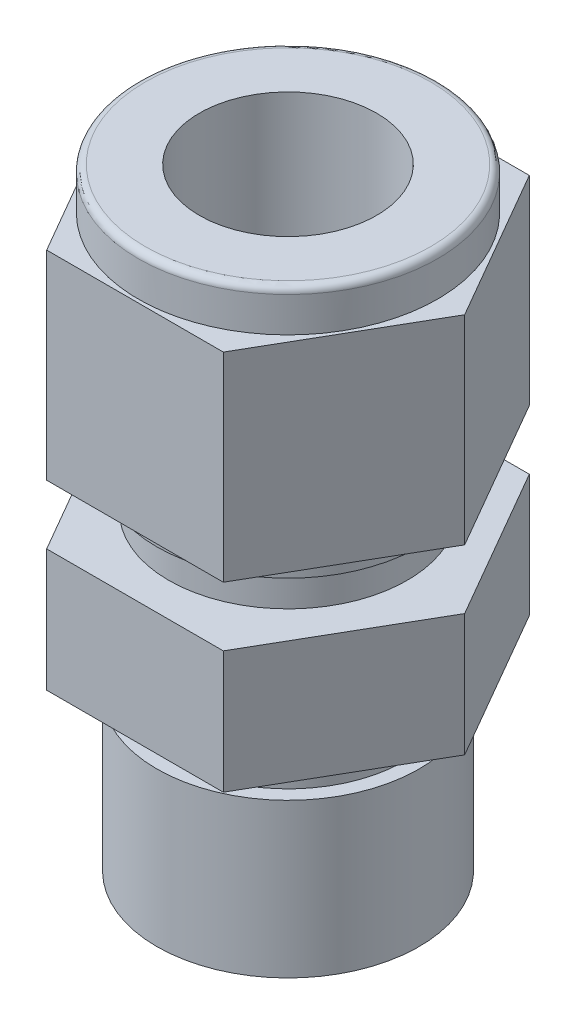
ISO-10303-21;
HEADER;
FILE_DESCRIPTION(('STEP AP214'),'2;1');
FILE_NAME('part.step','',(''),(''),'','','');
FILE_SCHEMA(('AUTOMOTIVE_DESIGN { 1 0 10303 214 1 1 1 1 }'));
ENDSEC;
DATA;
#1=APPLICATION_CONTEXT('core data for automotive mechanical design processes');
#2=APPLICATION_PROTOCOL_DEFINITION('international standard','automotive_design',2000,#1);
#3=PRODUCT_CONTEXT('',#1,'mechanical');
#4=PRODUCT('Part','Part','',(#3));
#5=PRODUCT_RELATED_PRODUCT_CATEGORY('part','',(#4));
#6=PRODUCT_DEFINITION_FORMATION('','',#4);
#7=PRODUCT_DEFINITION_CONTEXT('part definition',#1,'design');
#8=PRODUCT_DEFINITION('design','',#6,#7);
#9=PRODUCT_DEFINITION_SHAPE('','',#8);
#10=(LENGTH_UNIT() NAMED_UNIT(*) SI_UNIT(.MILLI.,.METRE.));
#11=(NAMED_UNIT(*) PLANE_ANGLE_UNIT() SI_UNIT($,.RADIAN.));
#12=(NAMED_UNIT(*) SI_UNIT($,.STERADIAN.) SOLID_ANGLE_UNIT());
#13=UNCERTAINTY_MEASURE_WITH_UNIT(LENGTH_MEASURE(1.E-05),#10,'distance_accuracy_value','');
#14=(GEOMETRIC_REPRESENTATION_CONTEXT(3) GLOBAL_UNCERTAINTY_ASSIGNED_CONTEXT((#13)) GLOBAL_UNIT_ASSIGNED_CONTEXT((#10,
#11,#12)) REPRESENTATION_CONTEXT('',''));
#15=CARTESIAN_POINT('',(0.,0.,0.));
#16=DIRECTION('',(0.,0.,1.));
#17=DIRECTION('',(1.,0.,0.));
#18=AXIS2_PLACEMENT_3D('',#15,#16,#17);
#19=CARTESIAN_POINT('',(0.,11.176,0.));
#20=DIRECTION('',(0.,-1.,0.));
#21=DIRECTION('',(0.,0.,-1.));
#22=AXIS2_PLACEMENT_3D('',#19,#20,#21);
#23=CYLINDRICAL_SURFACE('',#22,9.525);
#24=CARTESIAN_POINT('',(0.,11.176,0.));
#25=DIRECTION('',(0.,1.,0.));
#26=DIRECTION('',(0.,0.,1.));
#27=AXIS2_PLACEMENT_3D('',#24,#25,#26);
#28=CIRCLE('',#27,9.525);
#29=CARTESIAN_POINT('',(0.,11.176,9.525));
#30=VERTEX_POINT('',#29);
#31=EDGE_CURVE('E152',#30,#30,#28,.T.);
#32=ORIENTED_EDGE('',*,*,#31,.F.);
#33=EDGE_LOOP('',(#32));
#34=FACE_BOUND('',#33,.T.);
#35=CARTESIAN_POINT('',(0.,0.,0.));
#36=DIRECTION('',(0.,1.,0.));
#37=DIRECTION('',(0.,0.,1.));
#38=AXIS2_PLACEMENT_3D('',#35,#36,#37);
#39=CIRCLE('',#38,9.525);
#40=CARTESIAN_POINT('',(0.,0.,9.525));
#41=VERTEX_POINT('',#40);
#42=EDGE_CURVE('E149',#41,#41,#39,.T.);
#43=ORIENTED_EDGE('',*,*,#42,.T.);
#44=EDGE_LOOP('',(#43));
#45=FACE_BOUND('',#44,.T.);
#46=ADVANCED_FACE('F35',(#34,#45),#23,.T.);
#47=CARTESIAN_POINT('',(0.,11.176,0.));
#48=DIRECTION('',(0.,1.,0.));
#49=DIRECTION('',(0.,0.,1.));
#50=AXIS2_PLACEMENT_3D('',#47,#48,#49);
#51=PLANE('',#50);
#52=CARTESIAN_POINT('',(0.,11.176,0.));
#53=DIRECTION('',(0.,1.,0.));
#54=DIRECTION('',(0.,0.,1.));
#55=AXIS2_PLACEMENT_3D('',#52,#53,#54);
#56=CIRCLE('',#55,8.509);
#57=CARTESIAN_POINT('',(0.,11.176,8.509));
#58=VERTEX_POINT('',#57);
#59=EDGE_CURVE('E145',#58,#58,#56,.T.);
#60=ORIENTED_EDGE('',*,*,#59,.F.);
#61=EDGE_LOOP('',(#60));
#62=FACE_BOUND('',#61,.T.);
#63=ORIENTED_EDGE('',*,*,#31,.T.);
#64=EDGE_LOOP('',(#63));
#65=FACE_BOUND('',#64,.T.);
#66=ADVANCED_FACE('F175',(#62,#65),#51,.T.);
#67=CARTESIAN_POINT('',(0.,0.,0.));
#68=DIRECTION('',(0.,1.,0.));
#69=DIRECTION('',(0.,0.,1.));
#70=AXIS2_PLACEMENT_3D('',#67,#68,#69);
#71=PLANE('',#70);
#72=CARTESIAN_POINT('',(0.,0.,0.));
#73=DIRECTION('',(0.,1.,0.));
#74=DIRECTION('',(0.,0.,1.));
#75=AXIS2_PLACEMENT_3D('',#72,#73,#74);
#76=CIRCLE('',#75,6.4389);
#77=CARTESIAN_POINT('',(0.,0.,6.4389));
#78=VERTEX_POINT('',#77);
#79=EDGE_CURVE('E271',#78,#78,#76,.T.);
#80=ORIENTED_EDGE('',*,*,#79,.T.);
#81=EDGE_LOOP('',(#80));
#82=FACE_BOUND('',#81,.T.);
#83=ORIENTED_EDGE('',*,*,#42,.F.);
#84=EDGE_LOOP('',(#83));
#85=FACE_BOUND('',#84,.T.);
#86=ADVANCED_FACE('F180',(#82,#85),#71,.F.);
#87=CARTESIAN_POINT('',(0.,13.716,0.));
#88=DIRECTION('',(0.,-1.,0.));
#89=DIRECTION('',(0.,0.,-1.));
#90=AXIS2_PLACEMENT_3D('',#87,#88,#89);
#91=CYLINDRICAL_SURFACE('',#90,8.509);
#92=CARTESIAN_POINT('',(0.,13.716,0.));
#93=DIRECTION('',(0.,1.,0.));
#94=DIRECTION('',(0.,0.,1.));
#95=AXIS2_PLACEMENT_3D('',#92,#93,#94);
#96=CIRCLE('',#95,8.509);
#97=CARTESIAN_POINT('',(0.,13.716,8.509));
#98=VERTEX_POINT('',#97);
#99=EDGE_CURVE('E146',#98,#98,#96,.T.);
#100=ORIENTED_EDGE('',*,*,#99,.F.);
#101=EDGE_LOOP('',(#100));
#102=FACE_BOUND('',#101,.T.);
#103=ORIENTED_EDGE('',*,*,#59,.T.);
#104=EDGE_LOOP('',(#103));
#105=FACE_BOUND('',#104,.T.);
#106=ADVANCED_FACE('F187',(#102,#105),#91,.T.);
#107=CARTESIAN_POINT('',(6.41580486636972,22.606,11.1125));
#108=DIRECTION('',(-0.866025403784439,0.,-0.5));
#109=DIRECTION('',(-0.5,0.,0.866025403784439));
#110=AXIS2_PLACEMENT_3D('',#107,#108,#109);
#111=PLANE('',#110);
#112=DIRECTION('',(0.5,0.,-0.866025403784439));
#113=VECTOR('',#112,1.);
#114=CARTESIAN_POINT('',(6.41580486636972,13.716,11.1125));
#115=LINE('',#114,#113);
#116=CARTESIAN_POINT('',(6.41580486636972,13.716,11.1125));
#117=VERTEX_POINT('',#116);
#118=CARTESIAN_POINT('',(12.8316097327394,13.716,0.));
#119=VERTEX_POINT('',#118);
#120=EDGE_CURVE('E125',#117,#119,#115,.T.);
#121=ORIENTED_EDGE('',*,*,#120,.T.);
#122=DIRECTION('',(0.,-1.,0.));
#123=VECTOR('',#122,1.);
#124=CARTESIAN_POINT('',(12.8316097327394,22.606,0.));
#125=LINE('',#124,#123);
#126=CARTESIAN_POINT('',(12.8316097327394,22.606,0.));
#127=VERTEX_POINT('',#126);
#128=EDGE_CURVE('E143',#127,#119,#125,.T.);
#129=ORIENTED_EDGE('',*,*,#128,.F.);
#130=DIRECTION('',(0.5,0.,-0.866025403784439));
#131=VECTOR('',#130,1.);
#132=CARTESIAN_POINT('',(6.41580486636972,22.606,11.1125));
#133=LINE('',#132,#131);
#134=CARTESIAN_POINT('',(6.41580486636972,22.606,11.1125));
#135=VERTEX_POINT('',#134);
#136=EDGE_CURVE('E136',#135,#127,#133,.T.);
#137=ORIENTED_EDGE('',*,*,#136,.F.);
#138=DIRECTION('',(0.,-1.,0.));
#139=VECTOR('',#138,1.);
#140=CARTESIAN_POINT('',(6.41580486636972,22.606,11.1125));
#141=LINE('',#140,#139);
#142=EDGE_CURVE('E121',#135,#117,#141,.T.);
#143=ORIENTED_EDGE('',*,*,#142,.T.);
#144=EDGE_LOOP('',(#121,#129,#137,#143));
#145=FACE_BOUND('',#144,.T.);
#146=ADVANCED_FACE('F192',(#145),#111,.F.);
#147=CARTESIAN_POINT('',(12.8316097327394,22.606,0.));
#148=DIRECTION('',(-0.866025403784438,0.,0.5));
#149=DIRECTION('',(0.5,0.,0.866025403784438));
#150=AXIS2_PLACEMENT_3D('',#147,#148,#149);
#151=PLANE('',#150);
#152=DIRECTION('',(-0.5,0.,-0.866025403784438));
#153=VECTOR('',#152,1.);
#154=CARTESIAN_POINT('',(12.8316097327394,13.716,0.));
#155=LINE('',#154,#153);
#156=CARTESIAN_POINT('',(6.41580486636971,13.716,-11.1125));
#157=VERTEX_POINT('',#156);
#158=EDGE_CURVE('E128',#119,#157,#155,.T.);
#159=ORIENTED_EDGE('',*,*,#158,.T.);
#160=DIRECTION('',(0.,-1.,0.));
#161=VECTOR('',#160,1.);
#162=CARTESIAN_POINT('',(6.41580486636971,22.606,-11.1125));
#163=LINE('',#162,#161);
#164=CARTESIAN_POINT('',(6.41580486636971,22.606,-11.1125));
#165=VERTEX_POINT('',#164);
#166=EDGE_CURVE('E140',#165,#157,#163,.T.);
#167=ORIENTED_EDGE('',*,*,#166,.F.);
#168=DIRECTION('',(-0.5,0.,-0.866025403784438));
#169=VECTOR('',#168,1.);
#170=CARTESIAN_POINT('',(12.8316097327394,22.606,0.));
#171=LINE('',#170,#169);
#172=EDGE_CURVE('E91',#127,#165,#171,.T.);
#173=ORIENTED_EDGE('',*,*,#172,.F.);
#174=ORIENTED_EDGE('',*,*,#128,.T.);
#175=EDGE_LOOP('',(#159,#167,#173,#174));
#176=FACE_BOUND('',#175,.T.);
#177=ADVANCED_FACE('F196',(#176),#151,.F.);
#178=CARTESIAN_POINT('',(6.41580486636971,22.606,-11.1125));
#179=DIRECTION('',(0.,0.,1.));
#180=DIRECTION('',(1.,0.,0.));
#181=AXIS2_PLACEMENT_3D('',#178,#179,#180);
#182=PLANE('',#181);
#183=DIRECTION('',(-1.,0.,0.));
#184=VECTOR('',#183,1.);
#185=CARTESIAN_POINT('',(6.41580486636971,13.716,-11.1125));
#186=LINE('',#185,#184);
#187=CARTESIAN_POINT('',(-6.41580486636972,13.716,-11.1125));
#188=VERTEX_POINT('',#187);
#189=EDGE_CURVE('E131',#157,#188,#186,.T.);
#190=ORIENTED_EDGE('',*,*,#189,.T.);
#191=DIRECTION('',(0.,-1.,0.));
#192=VECTOR('',#191,1.);
#193=CARTESIAN_POINT('',(-6.41580486636972,22.606,-11.1125));
#194=LINE('',#193,#192);
#195=CARTESIAN_POINT('',(-6.41580486636972,22.606,-11.1125));
#196=VERTEX_POINT('',#195);
#197=EDGE_CURVE('E116',#196,#188,#194,.T.);
#198=ORIENTED_EDGE('',*,*,#197,.F.);
#199=DIRECTION('',(-1.,0.,0.));
#200=VECTOR('',#199,1.);
#201=CARTESIAN_POINT('',(6.41580486636971,22.606,-11.1125));
#202=LINE('',#201,#200);
#203=EDGE_CURVE('E107',#165,#196,#202,.T.);
#204=ORIENTED_EDGE('',*,*,#203,.F.);
#205=ORIENTED_EDGE('',*,*,#166,.T.);
#206=EDGE_LOOP('',(#190,#198,#204,#205));
#207=FACE_BOUND('',#206,.T.);
#208=ADVANCED_FACE('F200',(#207),#182,.F.);
#209=CARTESIAN_POINT('',(-6.41580486636972,22.606,-11.1125));
#210=DIRECTION('',(0.866025403784439,0.,0.5));
#211=DIRECTION('',(0.5,0.,-0.866025403784439));
#212=AXIS2_PLACEMENT_3D('',#209,#210,#211);
#213=PLANE('',#212);
#214=DIRECTION('',(-0.5,0.,0.866025403784438));
#215=VECTOR('',#214,1.);
#216=CARTESIAN_POINT('',(-6.41580486636972,13.716,-11.1125));
#217=LINE('',#216,#215);
#218=CARTESIAN_POINT('',(-12.8316097327394,13.716,0.));
#219=VERTEX_POINT('',#218);
#220=EDGE_CURVE('E115',#188,#219,#217,.T.);
#221=ORIENTED_EDGE('',*,*,#220,.T.);
#222=DIRECTION('',(0.,-1.,0.));
#223=VECTOR('',#222,1.);
#224=CARTESIAN_POINT('',(-12.8316097327394,22.606,0.));
#225=LINE('',#224,#223);
#226=CARTESIAN_POINT('',(-12.8316097327394,22.606,0.));
#227=VERTEX_POINT('',#226);
#228=EDGE_CURVE('E112',#227,#219,#225,.T.);
#229=ORIENTED_EDGE('',*,*,#228,.F.);
#230=DIRECTION('',(-0.5,0.,0.866025403784438));
#231=VECTOR('',#230,1.);
#232=CARTESIAN_POINT('',(-6.41580486636972,22.606,-11.1125));
#233=LINE('',#232,#231);
#234=EDGE_CURVE('E101',#196,#227,#233,.T.);
#235=ORIENTED_EDGE('',*,*,#234,.F.);
#236=ORIENTED_EDGE('',*,*,#197,.T.);
#237=EDGE_LOOP('',(#221,#229,#235,#236));
#238=FACE_BOUND('',#237,.T.);
#239=ADVANCED_FACE('F113',(#238),#213,.F.);
#240=CARTESIAN_POINT('',(-12.8316097327394,22.606,0.));
#241=DIRECTION('',(0.866025403784438,0.,-0.5));
#242=DIRECTION('',(-0.5,0.,-0.866025403784439));
#243=AXIS2_PLACEMENT_3D('',#240,#241,#242);
#244=PLANE('',#243);
#245=DIRECTION('',(0.5,0.,0.866025403784439));
#246=VECTOR('',#245,1.);
#247=CARTESIAN_POINT('',(-12.8316097327394,13.716,0.));
#248=LINE('',#247,#246);
#249=CARTESIAN_POINT('',(-6.41580486636971,13.716,11.1125));
#250=VERTEX_POINT('',#249);
#251=EDGE_CURVE('E76',#219,#250,#248,.T.);
#252=ORIENTED_EDGE('',*,*,#251,.T.);
#253=DIRECTION('',(0.,-1.,0.));
#254=VECTOR('',#253,1.);
#255=CARTESIAN_POINT('',(-6.41580486636971,22.606,11.1125));
#256=LINE('',#255,#254);
#257=CARTESIAN_POINT('',(-6.41580486636971,22.606,11.1125));
#258=VERTEX_POINT('',#257);
#259=EDGE_CURVE('E117',#258,#250,#256,.T.);
#260=ORIENTED_EDGE('',*,*,#259,.F.);
#261=DIRECTION('',(0.5,0.,0.866025403784439));
#262=VECTOR('',#261,1.);
#263=CARTESIAN_POINT('',(-12.8316097327394,22.606,0.));
#264=LINE('',#263,#262);
#265=EDGE_CURVE('E105',#227,#258,#264,.T.);
#266=ORIENTED_EDGE('',*,*,#265,.F.);
#267=ORIENTED_EDGE('',*,*,#228,.T.);
#268=EDGE_LOOP('',(#252,#260,#266,#267));
#269=FACE_BOUND('',#268,.T.);
#270=ADVANCED_FACE('F119',(#269),#244,.F.);
#271=CARTESIAN_POINT('',(-6.41580486636971,22.606,11.1125));
#272=DIRECTION('',(0.,0.,-1.));
#273=DIRECTION('',(-1.,0.,0.));
#274=AXIS2_PLACEMENT_3D('',#271,#272,#273);
#275=PLANE('',#274);
#276=DIRECTION('',(1.,0.,0.));
#277=VECTOR('',#276,1.);
#278=CARTESIAN_POINT('',(-6.41580486636971,13.716,11.1125));
#279=LINE('',#278,#277);
#280=EDGE_CURVE('E82',#250,#117,#279,.T.);
#281=ORIENTED_EDGE('',*,*,#280,.T.);
#282=ORIENTED_EDGE('',*,*,#142,.F.);
#283=DIRECTION('',(1.,0.,0.));
#284=VECTOR('',#283,1.);
#285=CARTESIAN_POINT('',(-6.41580486636971,22.606,11.1125));
#286=LINE('',#285,#284);
#287=EDGE_CURVE('E52',#258,#135,#286,.T.);
#288=ORIENTED_EDGE('',*,*,#287,.F.);
#289=ORIENTED_EDGE('',*,*,#259,.T.);
#290=EDGE_LOOP('',(#281,#282,#288,#289));
#291=FACE_BOUND('',#290,.T.);
#292=ADVANCED_FACE('F208',(#291),#275,.F.);
#293=CARTESIAN_POINT('',(0.,22.606,0.));
#294=DIRECTION('',(0.,1.,0.));
#295=DIRECTION('',(0.,0.,1.));
#296=AXIS2_PLACEMENT_3D('',#293,#294,#295);
#297=PLANE('',#296);
#298=CARTESIAN_POINT('',(0.,22.606,0.));
#299=DIRECTION('',(0.,1.,0.));
#300=DIRECTION('',(0.,0.,1.));
#301=AXIS2_PLACEMENT_3D('',#298,#299,#300);
#302=CIRCLE('',#301,8.6614);
#303=CARTESIAN_POINT('',(0.,22.606,8.6614));
#304=VERTEX_POINT('',#303);
#305=EDGE_CURVE('E335',#304,#304,#302,.T.);
#306=ORIENTED_EDGE('',*,*,#305,.F.);
#307=EDGE_LOOP('',(#306));
#308=FACE_BOUND('',#307,.T.);
#309=ORIENTED_EDGE('',*,*,#136,.T.);
#310=ORIENTED_EDGE('',*,*,#172,.T.);
#311=ORIENTED_EDGE('',*,*,#203,.T.);
#312=ORIENTED_EDGE('',*,*,#234,.T.);
#313=ORIENTED_EDGE('',*,*,#265,.T.);
#314=ORIENTED_EDGE('',*,*,#287,.T.);
#315=EDGE_LOOP('',(#309,#310,#311,#312,#313,#314));
#316=FACE_BOUND('',#315,.T.);
#317=ADVANCED_FACE('F103',(#308,#316),#297,.T.);
#318=CARTESIAN_POINT('',(0.,13.716,0.));
#319=DIRECTION('',(0.,1.,0.));
#320=DIRECTION('',(0.,0.,1.));
#321=AXIS2_PLACEMENT_3D('',#318,#319,#320);
#322=PLANE('',#321);
#323=ORIENTED_EDGE('',*,*,#99,.T.);
#324=EDGE_LOOP('',(#323));
#325=FACE_BOUND('',#324,.T.);
#326=ORIENTED_EDGE('',*,*,#120,.F.);
#327=ORIENTED_EDGE('',*,*,#280,.F.);
#328=ORIENTED_EDGE('',*,*,#251,.F.);
#329=ORIENTED_EDGE('',*,*,#220,.F.);
#330=ORIENTED_EDGE('',*,*,#189,.F.);
#331=ORIENTED_EDGE('',*,*,#158,.F.);
#332=EDGE_LOOP('',(#326,#327,#328,#329,#330,#331));
#333=FACE_BOUND('',#332,.T.);
#334=ADVANCED_FACE('F211',(#325,#333),#322,.F.);
#335=CARTESIAN_POINT('',(0.,25.146,0.));
#336=DIRECTION('',(0.,-1.,0.));
#337=DIRECTION('',(0.,0.,-1.));
#338=AXIS2_PLACEMENT_3D('',#335,#336,#337);
#339=CYLINDRICAL_SURFACE('',#338,8.6614);
#340=CARTESIAN_POINT('',(0.,25.146,0.));
#341=DIRECTION('',(0.,1.,0.));
#342=DIRECTION('',(0.,0.,1.));
#343=AXIS2_PLACEMENT_3D('',#340,#341,#342);
#344=CIRCLE('',#343,8.6614);
#345=CARTESIAN_POINT('',(0.,25.146,8.6614));
#346=VERTEX_POINT('',#345);
#347=EDGE_CURVE('E129',#346,#346,#344,.T.);
#348=ORIENTED_EDGE('',*,*,#347,.F.);
#349=EDGE_LOOP('',(#348));
#350=FACE_BOUND('',#349,.T.);
#351=ORIENTED_EDGE('',*,*,#305,.T.);
#352=EDGE_LOOP('',(#351));
#353=FACE_BOUND('',#352,.T.);
#354=ADVANCED_FACE('F214',(#350,#353),#339,.T.);
#355=CARTESIAN_POINT('',(0.,26.924,0.));
#356=DIRECTION('',(0.,-1.,0.));
#357=DIRECTION('',(0.,0.,-1.));
#358=AXIS2_PLACEMENT_3D('',#355,#356,#357);
#359=CYLINDRICAL_SURFACE('',#358,9.525);
#360=CARTESIAN_POINT('',(0.,26.924,0.));
#361=DIRECTION('',(0.,1.,0.));
#362=DIRECTION('',(0.,0.,1.));
#363=AXIS2_PLACEMENT_3D('',#360,#361,#362);
#364=CIRCLE('',#363,9.525);
#365=CARTESIAN_POINT('',(0.,26.924,9.525));
#366=VERTEX_POINT('',#365);
#367=EDGE_CURVE('E332',#366,#366,#364,.T.);
#368=ORIENTED_EDGE('',*,*,#367,.F.);
#369=EDGE_LOOP('',(#368));
#370=FACE_BOUND('',#369,.T.);
#371=CARTESIAN_POINT('',(0.,25.146,0.));
#372=DIRECTION('',(0.,1.,0.));
#373=DIRECTION('',(0.,0.,1.));
#374=AXIS2_PLACEMENT_3D('',#371,#372,#373);
#375=CIRCLE('',#374,9.525);
#376=CARTESIAN_POINT('',(0.,25.146,9.525));
#377=VERTEX_POINT('',#376);
#378=EDGE_CURVE('E331',#377,#377,#375,.T.);
#379=ORIENTED_EDGE('',*,*,#378,.T.);
#380=EDGE_LOOP('',(#379));
#381=FACE_BOUND('',#380,.T.);
#382=ADVANCED_FACE('F221',(#370,#381),#359,.T.);
#383=CARTESIAN_POINT('',(0.,25.146,0.));
#384=DIRECTION('',(0.,1.,0.));
#385=DIRECTION('',(0.,0.,1.));
#386=AXIS2_PLACEMENT_3D('',#383,#384,#385);
#387=PLANE('',#386);
#388=ORIENTED_EDGE('',*,*,#347,.T.);
#389=EDGE_LOOP('',(#388));
#390=FACE_BOUND('',#389,.T.);
#391=ORIENTED_EDGE('',*,*,#378,.F.);
#392=EDGE_LOOP('',(#391));
#393=FACE_BOUND('',#392,.T.);
#394=ADVANCED_FACE('F225',(#390,#393),#387,.F.);
#395=CARTESIAN_POINT('',(-12.8316097327394,41.402,0.));
#396=DIRECTION('',(0.866025403784439,0.,-0.5));
#397=DIRECTION('',(-0.5,0.,-0.866025403784439));
#398=AXIS2_PLACEMENT_3D('',#395,#396,#397);
#399=PLANE('',#398);
#400=DIRECTION('',(0.5,0.,0.866025403784439));
#401=VECTOR('',#400,1.);
#402=CARTESIAN_POINT('',(-12.8316097327394,26.924,0.));
#403=LINE('',#402,#401);
#404=CARTESIAN_POINT('',(-12.8316097327394,26.924,0.));
#405=VERTEX_POINT('',#404);
#406=CARTESIAN_POINT('',(-6.41580486636972,26.924,11.1125));
#407=VERTEX_POINT('',#406);
#408=EDGE_CURVE('E270',#405,#407,#403,.T.);
#409=ORIENTED_EDGE('',*,*,#408,.T.);
#410=DIRECTION('',(0.,-1.,0.));
#411=VECTOR('',#410,1.);
#412=CARTESIAN_POINT('',(-6.41580486636972,41.402,11.1125));
#413=LINE('',#412,#411);
#414=CARTESIAN_POINT('',(-6.41580486636972,41.402,11.1125));
#415=VERTEX_POINT('',#414);
#416=EDGE_CURVE('E328',#415,#407,#413,.T.);
#417=ORIENTED_EDGE('',*,*,#416,.F.);
#418=DIRECTION('',(0.5,0.,0.866025403784439));
#419=VECTOR('',#418,1.);
#420=CARTESIAN_POINT('',(-12.8316097327394,41.402,0.));
#421=LINE('',#420,#419);
#422=CARTESIAN_POINT('',(-12.8316097327394,41.402,0.));
#423=VERTEX_POINT('',#422);
#424=EDGE_CURVE('E281',#423,#415,#421,.T.);
#425=ORIENTED_EDGE('',*,*,#424,.F.);
#426=DIRECTION('',(0.,-1.,0.));
#427=VECTOR('',#426,1.);
#428=CARTESIAN_POINT('',(-12.8316097327394,41.402,0.));
#429=LINE('',#428,#427);
#430=EDGE_CURVE('E299',#423,#405,#429,.T.);
#431=ORIENTED_EDGE('',*,*,#430,.T.);
#432=EDGE_LOOP('',(#409,#417,#425,#431));
#433=FACE_BOUND('',#432,.T.);
#434=ADVANCED_FACE('F229',(#433),#399,.F.);
#435=CARTESIAN_POINT('',(-6.41580486636972,41.402,11.1125));
#436=DIRECTION('',(0.,0.,-1.));
#437=DIRECTION('',(-1.,0.,0.));
#438=AXIS2_PLACEMENT_3D('',#435,#436,#437);
#439=PLANE('',#438);
#440=DIRECTION('',(1.,0.,0.));
#441=VECTOR('',#440,1.);
#442=CARTESIAN_POINT('',(-6.41580486636972,26.924,11.1125));
#443=LINE('',#442,#441);
#444=CARTESIAN_POINT('',(6.41580486636972,26.924,11.1125));
#445=VERTEX_POINT('',#444);
#446=EDGE_CURVE('E274',#407,#445,#443,.T.);
#447=ORIENTED_EDGE('',*,*,#446,.T.);
#448=DIRECTION('',(0.,-1.,0.));
#449=VECTOR('',#448,1.);
#450=CARTESIAN_POINT('',(6.41580486636972,41.402,11.1125));
#451=LINE('',#450,#449);
#452=CARTESIAN_POINT('',(6.41580486636972,41.402,11.1125));
#453=VERTEX_POINT('',#452);
#454=EDGE_CURVE('E325',#453,#445,#451,.T.);
#455=ORIENTED_EDGE('',*,*,#454,.F.);
#456=DIRECTION('',(1.,0.,0.));
#457=VECTOR('',#456,1.);
#458=CARTESIAN_POINT('',(-6.41580486636972,41.402,11.1125));
#459=LINE('',#458,#457);
#460=EDGE_CURVE('E284',#415,#453,#459,.T.);
#461=ORIENTED_EDGE('',*,*,#460,.F.);
#462=ORIENTED_EDGE('',*,*,#416,.T.);
#463=EDGE_LOOP('',(#447,#455,#461,#462));
#464=FACE_BOUND('',#463,.T.);
#465=ADVANCED_FACE('F233',(#464),#439,.F.);
#466=CARTESIAN_POINT('',(6.41580486636972,41.402,11.1125));
#467=DIRECTION('',(-0.866025403784439,0.,-0.5));
#468=DIRECTION('',(-0.5,0.,0.866025403784439));
#469=AXIS2_PLACEMENT_3D('',#466,#467,#468);
#470=PLANE('',#469);
#471=DIRECTION('',(0.5,0.,-0.866025403784439));
#472=VECTOR('',#471,1.);
#473=CARTESIAN_POINT('',(6.41580486636972,26.924,11.1125));
#474=LINE('',#473,#472);
#475=CARTESIAN_POINT('',(12.8316097327394,26.924,0.));
#476=VERTEX_POINT('',#475);
#477=EDGE_CURVE('E303',#445,#476,#474,.T.);
#478=ORIENTED_EDGE('',*,*,#477,.T.);
#479=DIRECTION('',(0.,-1.,0.));
#480=VECTOR('',#479,1.);
#481=CARTESIAN_POINT('',(12.8316097327394,41.402,0.));
#482=LINE('',#481,#480);
#483=CARTESIAN_POINT('',(12.8316097327394,41.402,0.));
#484=VERTEX_POINT('',#483);
#485=EDGE_CURVE('E322',#484,#476,#482,.T.);
#486=ORIENTED_EDGE('',*,*,#485,.F.);
#487=DIRECTION('',(0.5,0.,-0.866025403784439));
#488=VECTOR('',#487,1.);
#489=CARTESIAN_POINT('',(6.41580486636972,41.402,11.1125));
#490=LINE('',#489,#488);
#491=EDGE_CURVE('E288',#453,#484,#490,.T.);
#492=ORIENTED_EDGE('',*,*,#491,.F.);
#493=ORIENTED_EDGE('',*,*,#454,.T.);
#494=EDGE_LOOP('',(#478,#486,#492,#493));
#495=FACE_BOUND('',#494,.T.);
#496=ADVANCED_FACE('F237',(#495),#470,.F.);
#497=CARTESIAN_POINT('',(12.8316097327394,41.402,0.));
#498=DIRECTION('',(-0.866025403784439,0.,0.5));
#499=DIRECTION('',(0.5,0.,0.866025403784439));
#500=AXIS2_PLACEMENT_3D('',#497,#498,#499);
#501=PLANE('',#500);
#502=DIRECTION('',(-0.5,0.,-0.866025403784439));
#503=VECTOR('',#502,1.);
#504=CARTESIAN_POINT('',(12.8316097327394,26.924,0.));
#505=LINE('',#504,#503);
#506=CARTESIAN_POINT('',(6.41580486636972,26.924,-11.1125));
#507=VERTEX_POINT('',#506);
#508=EDGE_CURVE('E306',#476,#507,#505,.T.);
#509=ORIENTED_EDGE('',*,*,#508,.T.);
#510=DIRECTION('',(0.,-1.,0.));
#511=VECTOR('',#510,1.);
#512=CARTESIAN_POINT('',(6.41580486636972,41.402,-11.1125));
#513=LINE('',#512,#511);
#514=CARTESIAN_POINT('',(6.41580486636972,41.402,-11.1125));
#515=VERTEX_POINT('',#514);
#516=EDGE_CURVE('E319',#515,#507,#513,.T.);
#517=ORIENTED_EDGE('',*,*,#516,.F.);
#518=DIRECTION('',(-0.5,0.,-0.866025403784439));
#519=VECTOR('',#518,1.);
#520=CARTESIAN_POINT('',(12.8316097327394,41.402,0.));
#521=LINE('',#520,#519);
#522=EDGE_CURVE('E291',#484,#515,#521,.T.);
#523=ORIENTED_EDGE('',*,*,#522,.F.);
#524=ORIENTED_EDGE('',*,*,#485,.T.);
#525=EDGE_LOOP('',(#509,#517,#523,#524));
#526=FACE_BOUND('',#525,.T.);
#527=ADVANCED_FACE('F241',(#526),#501,.F.);
#528=CARTESIAN_POINT('',(6.41580486636972,41.402,-11.1125));
#529=DIRECTION('',(0.,0.,1.));
#530=DIRECTION('',(1.,0.,0.));
#531=AXIS2_PLACEMENT_3D('',#528,#529,#530);
#532=PLANE('',#531);
#533=DIRECTION('',(-1.,0.,0.));
#534=VECTOR('',#533,1.);
#535=CARTESIAN_POINT('',(6.41580486636972,26.924,-11.1125));
#536=LINE('',#535,#534);
#537=CARTESIAN_POINT('',(-6.41580486636972,26.924,-11.1125));
#538=VERTEX_POINT('',#537);
#539=EDGE_CURVE('E309',#507,#538,#536,.T.);
#540=ORIENTED_EDGE('',*,*,#539,.T.);
#541=DIRECTION('',(0.,-1.,0.));
#542=VECTOR('',#541,1.);
#543=CARTESIAN_POINT('',(-6.41580486636972,41.402,-11.1125));
#544=LINE('',#543,#542);
#545=CARTESIAN_POINT('',(-6.41580486636972,41.402,-11.1125));
#546=VERTEX_POINT('',#545);
#547=EDGE_CURVE('E316',#546,#538,#544,.T.);
#548=ORIENTED_EDGE('',*,*,#547,.F.);
#549=DIRECTION('',(-1.,0.,0.));
#550=VECTOR('',#549,1.);
#551=CARTESIAN_POINT('',(6.41580486636972,41.402,-11.1125));
#552=LINE('',#551,#550);
#553=EDGE_CURVE('E294',#515,#546,#552,.T.);
#554=ORIENTED_EDGE('',*,*,#553,.F.);
#555=ORIENTED_EDGE('',*,*,#516,.T.);
#556=EDGE_LOOP('',(#540,#548,#554,#555));
#557=FACE_BOUND('',#556,.T.);
#558=ADVANCED_FACE('F245',(#557),#532,.F.);
#559=CARTESIAN_POINT('',(-6.41580486636972,41.402,-11.1125));
#560=DIRECTION('',(0.866025403784439,0.,0.5));
#561=DIRECTION('',(0.5,0.,-0.866025403784439));
#562=AXIS2_PLACEMENT_3D('',#559,#560,#561);
#563=PLANE('',#562);
#564=DIRECTION('',(-0.5,0.,0.866025403784439));
#565=VECTOR('',#564,1.);
#566=CARTESIAN_POINT('',(-6.41580486636972,26.924,-11.1125));
#567=LINE('',#566,#565);
#568=EDGE_CURVE('E285',#538,#405,#567,.T.);
#569=ORIENTED_EDGE('',*,*,#568,.T.);
#570=ORIENTED_EDGE('',*,*,#430,.F.);
#571=DIRECTION('',(-0.5,0.,0.866025403784439));
#572=VECTOR('',#571,1.);
#573=CARTESIAN_POINT('',(-6.41580486636972,41.402,-11.1125));
#574=LINE('',#573,#572);
#575=EDGE_CURVE('E297',#546,#423,#574,.T.);
#576=ORIENTED_EDGE('',*,*,#575,.F.);
#577=ORIENTED_EDGE('',*,*,#547,.T.);
#578=EDGE_LOOP('',(#569,#570,#576,#577));
#579=FACE_BOUND('',#578,.T.);
#580=ADVANCED_FACE('F249',(#579),#563,.F.);
#581=CARTESIAN_POINT('',(0.,41.402,0.));
#582=DIRECTION('',(0.,1.,0.));
#583=DIRECTION('',(0.,0.,1.));
#584=AXIS2_PLACEMENT_3D('',#581,#582,#583);
#585=PLANE('',#584);
#586=CARTESIAN_POINT('',(0.,41.402,0.));
#587=DIRECTION('',(0.,1.,0.));
#588=DIRECTION('',(0.,0.,1.));
#589=AXIS2_PLACEMENT_3D('',#586,#587,#588);
#590=CIRCLE('',#589,10.8712);
#591=CARTESIAN_POINT('',(0.,41.402,-10.8712));
#592=VERTEX_POINT('',#591);
#593=EDGE_CURVE('E269',#592,#592,#590,.T.);
#594=ORIENTED_EDGE('',*,*,#593,.F.);
#595=EDGE_LOOP('',(#594));
#596=FACE_BOUND('',#595,.T.);
#597=ORIENTED_EDGE('',*,*,#424,.T.);
#598=ORIENTED_EDGE('',*,*,#460,.T.);
#599=ORIENTED_EDGE('',*,*,#491,.T.);
#600=ORIENTED_EDGE('',*,*,#522,.T.);
#601=ORIENTED_EDGE('',*,*,#553,.T.);
#602=ORIENTED_EDGE('',*,*,#575,.T.);
#603=EDGE_LOOP('',(#597,#598,#599,#600,#601,#602));
#604=FACE_BOUND('',#603,.T.);
#605=ADVANCED_FACE('F253',(#596,#604),#585,.T.);
#606=CARTESIAN_POINT('',(0.,26.924,0.));
#607=DIRECTION('',(0.,1.,0.));
#608=DIRECTION('',(0.,0.,1.));
#609=AXIS2_PLACEMENT_3D('',#606,#607,#608);
#610=PLANE('',#609);
#611=ORIENTED_EDGE('',*,*,#367,.T.);
#612=EDGE_LOOP('',(#611));
#613=FACE_BOUND('',#612,.T.);
#614=ORIENTED_EDGE('',*,*,#408,.F.);
#615=ORIENTED_EDGE('',*,*,#568,.F.);
#616=ORIENTED_EDGE('',*,*,#539,.F.);
#617=ORIENTED_EDGE('',*,*,#508,.F.);
#618=ORIENTED_EDGE('',*,*,#477,.F.);
#619=ORIENTED_EDGE('',*,*,#446,.F.);
#620=EDGE_LOOP('',(#614,#615,#616,#617,#618,#619));
#621=FACE_BOUND('',#620,.T.);
#622=ADVANCED_FACE('F255',(#613,#621),#610,.F.);
#623=CARTESIAN_POINT('',(0.,44.45,0.));
#624=DIRECTION('',(0.,-1.,0.));
#625=DIRECTION('',(0.,0.,-1.));
#626=AXIS2_PLACEMENT_3D('',#623,#624,#625);
#627=CYLINDRICAL_SURFACE('',#626,10.8712);
#628=CARTESIAN_POINT('',(0.,43.942,0.));
#629=DIRECTION('',(0.,1.,0.));
#630=DIRECTION('',(0.,0.,1.));
#631=AXIS2_PLACEMENT_3D('',#628,#629,#630);
#632=CIRCLE('',#631,10.8712);
#633=CARTESIAN_POINT('',(0.,43.942,-10.8712));
#634=VERTEX_POINT('',#633);
#635=EDGE_CURVE('E11',#634,#634,#632,.F.);
#636=CARTESIAN_POINT('',(0.,43.942,-10.8712));
#637=CARTESIAN_POINT('',(0.,43.9155416666667,-10.8712));
#638=CARTESIAN_POINT('',(0.,43.8890833333333,-10.8712));
#639=CARTESIAN_POINT('',(0.,43.8361666666667,-10.8712));
#640=CARTESIAN_POINT('',(0.,43.8097083333333,-10.8712));
#641=CARTESIAN_POINT('',(0.,43.7567916666667,-10.8712));
#642=CARTESIAN_POINT('',(0.,43.7303333333333,-10.8712));
#643=CARTESIAN_POINT('',(0.,43.6774166666667,-10.8712));
#644=CARTESIAN_POINT('',(0.,43.6509583333333,-10.8712));
#645=CARTESIAN_POINT('',(0.,43.5980416666667,-10.8712));
#646=CARTESIAN_POINT('',(0.,43.5715833333333,-10.8712));
#647=CARTESIAN_POINT('',(0.,43.5186666666667,-10.8712));
#648=CARTESIAN_POINT('',(0.,43.4922083333333,-10.8712));
#649=CARTESIAN_POINT('',(0.,43.4392916666667,-10.8712));
#650=CARTESIAN_POINT('',(0.,43.4128333333333,-10.8712));
#651=CARTESIAN_POINT('',(0.,43.3599166666667,-10.8712));
#652=CARTESIAN_POINT('',(0.,43.3334583333333,-10.8712));
#653=CARTESIAN_POINT('',(0.,43.2805416666667,-10.8712));
#654=CARTESIAN_POINT('',(0.,43.2540833333333,-10.8712));
#655=CARTESIAN_POINT('',(0.,43.2011666666667,-10.8712));
#656=CARTESIAN_POINT('',(0.,43.1747083333333,-10.8712));
#657=CARTESIAN_POINT('',(0.,43.1217916666667,-10.8712));
#658=CARTESIAN_POINT('',(0.,43.0953333333333,-10.8712));
#659=CARTESIAN_POINT('',(0.,43.0424166666667,-10.8712));
#660=CARTESIAN_POINT('',(0.,43.0159583333333,-10.8712));
#661=CARTESIAN_POINT('',(0.,42.9630416666667,-10.8712));
#662=CARTESIAN_POINT('',(0.,42.9365833333333,-10.8712));
#663=CARTESIAN_POINT('',(0.,42.8836666666667,-10.8712));
#664=CARTESIAN_POINT('',(0.,42.8572083333333,-10.8712));
#665=CARTESIAN_POINT('',(0.,42.8042916666667,-10.8712));
#666=CARTESIAN_POINT('',(0.,42.7778333333333,-10.8712));
#667=CARTESIAN_POINT('',(0.,42.7249166666667,-10.8712));
#668=CARTESIAN_POINT('',(0.,42.6984583333333,-10.8712));
#669=CARTESIAN_POINT('',(0.,42.6455416666667,-10.8712));
#670=CARTESIAN_POINT('',(0.,42.6190833333333,-10.8712));
#671=CARTESIAN_POINT('',(0.,42.5661666666667,-10.8712));
#672=CARTESIAN_POINT('',(0.,42.5397083333333,-10.8712));
#673=CARTESIAN_POINT('',(0.,42.4867916666667,-10.8712));
#674=CARTESIAN_POINT('',(0.,42.4603333333333,-10.8712));
#675=CARTESIAN_POINT('',(0.,42.4074166666667,-10.8712));
#676=CARTESIAN_POINT('',(0.,42.3809583333333,-10.8712));
#677=CARTESIAN_POINT('',(0.,42.3280416666667,-10.8712));
#678=CARTESIAN_POINT('',(0.,42.3015833333333,-10.8712));
#679=CARTESIAN_POINT('',(0.,42.2486666666667,-10.8712));
#680=CARTESIAN_POINT('',(0.,42.2222083333333,-10.8712));
#681=CARTESIAN_POINT('',(0.,42.1692916666667,-10.8712));
#682=CARTESIAN_POINT('',(0.,42.1428333333333,-10.8712));
#683=CARTESIAN_POINT('',(0.,42.0899166666667,-10.8712));
#684=CARTESIAN_POINT('',(0.,42.0634583333333,-10.8712));
#685=CARTESIAN_POINT('',(0.,42.0105416666667,-10.8712));
#686=CARTESIAN_POINT('',(0.,41.9840833333333,-10.8712));
#687=CARTESIAN_POINT('',(0.,41.9311666666667,-10.8712));
#688=CARTESIAN_POINT('',(0.,41.9047083333333,-10.8712));
#689=CARTESIAN_POINT('',(0.,41.8517916666667,-10.8712));
#690=CARTESIAN_POINT('',(0.,41.8253333333333,-10.8712));
#691=CARTESIAN_POINT('',(0.,41.7724166666667,-10.8712));
#692=CARTESIAN_POINT('',(0.,41.7459583333333,-10.8712));
#693=CARTESIAN_POINT('',(0.,41.6930416666667,-10.8712));
#694=CARTESIAN_POINT('',(0.,41.6665833333333,-10.8712));
#695=CARTESIAN_POINT('',(0.,41.6136666666667,-10.8712));
#696=CARTESIAN_POINT('',(0.,41.5872083333333,-10.8712));
#697=CARTESIAN_POINT('',(0.,41.5342916666667,-10.8712));
#698=CARTESIAN_POINT('',(0.,41.5078333333333,-10.8712));
#699=CARTESIAN_POINT('',(0.,41.4549166666667,-10.8712));
#700=CARTESIAN_POINT('',(0.,41.4284583333333,-10.8712));
#701=CARTESIAN_POINT('',(0.,41.402,-10.8712));
#702=B_SPLINE_CURVE_WITH_KNOTS('',3,(#636,#637,#638,#639,#640,#641,#642,#643,#644,#645,#646,
#647,#648,#649,#650,#651,#652,#653,#654,#655,#656,#657,#658,#659,#660,#661,#662,#663,#664,#665,
#666,#667,#668,#669,#670,#671,#672,#673,#674,#675,#676,#677,#678,#679,#680,#681,#682,#683,#684,
#685,#686,#687,#688,#689,#690,#691,#692,#693,#694,#695,#696,#697,#698,#699,#700,#701),
.UNSPECIFIED.,.F.,.F.,(4,2,2,2,2,2,2,2,2,2,2,2,2,2,2,2,2,2,2,2,2,2,2,2,2,2,2,2,2,2,2,2,4),(0.,
0.0793750000000065,0.158750000000006,0.238125000000006,0.317500000000005,0.396875000000005,
0.476250000000004,0.555625000000004,0.635000000000004,0.714375000000003,0.793750000000003,
0.873125000000002,0.952500000000002,1.031875,1.11125,1.190625,1.27,1.34937500000001,
1.42875000000001,1.50812500000001,1.58750000000001,1.66687500000001,1.74625,1.825625,1.905,
1.984375,2.06375,2.143125,2.2225,2.301875,2.38125,2.460625,2.54),.UNSPECIFIED.);
#703=EDGE_CURVE('BSEAM170',#634,#592,#702,.T.);
#704=ORIENTED_EDGE('',*,*,#635,.T.);
#705=ORIENTED_EDGE('',*,*,#593,.T.);
#706=ORIENTED_EDGE('',*,*,#703,.T.);
#707=ORIENTED_EDGE('',*,*,#703,.F.);
#708=EDGE_LOOP('',(#704,#706,#705,#707));
#709=FACE_BOUND('',#708,.T.);
#710=ADVANCED_FACE('F170',(#709),#627,.T.);
#711=CARTESIAN_POINT('',(0.,44.45,0.));
#712=DIRECTION('',(0.,1.,0.));
#713=DIRECTION('',(0.,0.,1.));
#714=AXIS2_PLACEMENT_3D('',#711,#712,#713);
#715=PLANE('',#714);
#716=CARTESIAN_POINT('',(0.,44.45,0.));
#717=DIRECTION('',(0.,1.,0.));
#718=DIRECTION('',(0.,0.,1.));
#719=AXIS2_PLACEMENT_3D('',#716,#717,#718);
#720=CIRCLE('',#719,6.4389);
#721=CARTESIAN_POINT('',(0.,44.45,6.4389));
#722=VERTEX_POINT('',#721);
#723=EDGE_CURVE('E277',#722,#722,#720,.T.);
#724=ORIENTED_EDGE('',*,*,#723,.F.);
#725=EDGE_LOOP('',(#724));
#726=FACE_BOUND('',#725,.T.);
#727=CARTESIAN_POINT('',(0.,44.45,0.));
#728=DIRECTION('',(0.,1.,0.));
#729=DIRECTION('',(0.,0.,1.));
#730=AXIS2_PLACEMENT_3D('',#727,#728,#729);
#731=CIRCLE('',#730,10.3632);
#732=CARTESIAN_POINT('',(0.,44.45,10.3632));
#733=VERTEX_POINT('',#732);
#734=EDGE_CURVE('E44',#733,#733,#731,.T.);
#735=ORIENTED_EDGE('',*,*,#734,.T.);
#736=EDGE_LOOP('',(#735));
#737=FACE_BOUND('',#736,.T.);
#738=ADVANCED_FACE('F159',(#726,#737),#715,.T.);
#739=CARTESIAN_POINT('',(0.,43.942,0.));
#740=DIRECTION('',(0.,1.,0.));
#741=DIRECTION('',(0.,0.,1.));
#742=AXIS2_PLACEMENT_3D('',#739,#740,#741);
#743=TOROIDAL_SURFACE('',#742,10.3632,0.508);
#744=ORIENTED_EDGE('',*,*,#635,.F.);
#745=EDGE_LOOP('',(#744));
#746=FACE_BOUND('',#745,.T.);
#747=ORIENTED_EDGE('',*,*,#734,.F.);
#748=EDGE_LOOP('',(#747));
#749=FACE_BOUND('',#748,.T.);
#750=ADVANCED_FACE('F37',(#746,#749),#743,.T.);
#751=CARTESIAN_POINT('',(0.,0.,0.));
#752=DIRECTION('',(0.,1.,0.));
#753=DIRECTION('',(0.,0.,1.));
#754=AXIS2_PLACEMENT_3D('',#751,#752,#753);
#755=CYLINDRICAL_SURFACE('',#754,6.4389);
#756=ORIENTED_EDGE('',*,*,#79,.F.);
#757=EDGE_LOOP('',(#756));
#758=FACE_BOUND('',#757,.T.);
#759=ORIENTED_EDGE('',*,*,#723,.T.);
#760=EDGE_LOOP('',(#759));
#761=FACE_BOUND('',#760,.T.);
#762=ADVANCED_FACE('F162',(#758,#761),#755,.F.);
#763=CLOSED_SHELL('',(#46,#66,#86,#106,#146,#177,#208,#239,#270,#292,#317,#334,#354,#382,#394,
#434,#465,#496,#527,#558,#580,#605,#622,#710,#738,#750,#762));
#764=MANIFOLD_SOLID_BREP('B2',#763);
#765=ADVANCED_BREP_SHAPE_REPRESENTATION('',(#18,#764),#14);
#766=SHAPE_DEFINITION_REPRESENTATION(#9,#765);
ENDSEC;
END-ISO-10303-21;
